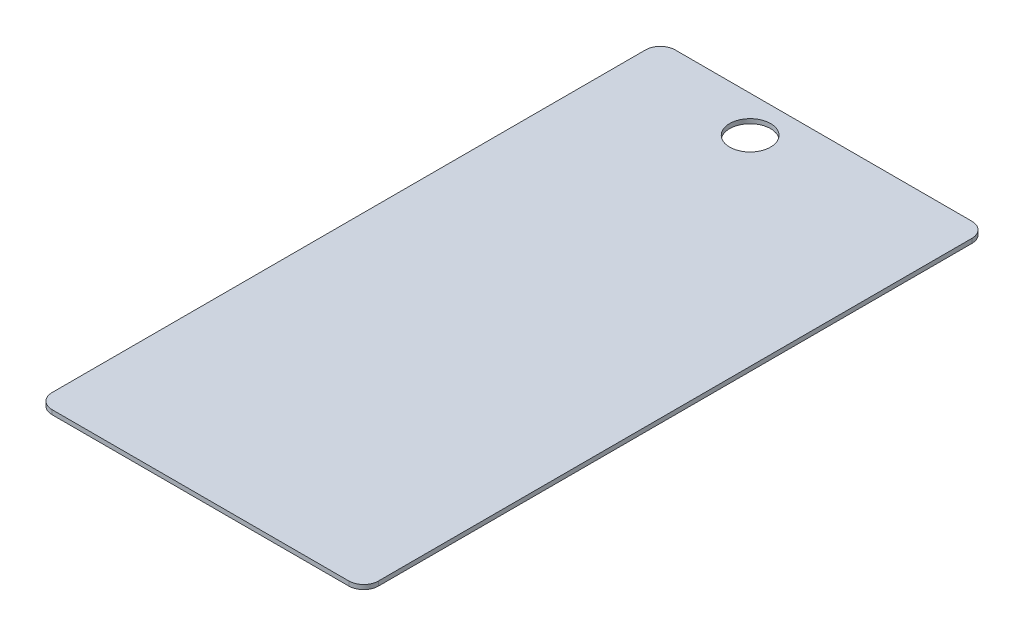
ISO-10303-21;
HEADER;
FILE_DESCRIPTION(('STEP AP214'),'2;1');
FILE_NAME('part.step','',(''),(''),'','','');
FILE_SCHEMA(('AUTOMOTIVE_DESIGN { 1 0 10303 214 1 1 1 1 }'));
ENDSEC;
DATA;
#1=APPLICATION_CONTEXT('core data for automotive mechanical design processes');
#2=APPLICATION_PROTOCOL_DEFINITION('international standard','automotive_design',2000,#1);
#3=PRODUCT_CONTEXT('',#1,'mechanical');
#4=PRODUCT('Part','Part','',(#3));
#5=PRODUCT_RELATED_PRODUCT_CATEGORY('part','',(#4));
#6=PRODUCT_DEFINITION_FORMATION('','',#4);
#7=PRODUCT_DEFINITION_CONTEXT('part definition',#1,'design');
#8=PRODUCT_DEFINITION('design','',#6,#7);
#9=PRODUCT_DEFINITION_SHAPE('','',#8);
#10=(LENGTH_UNIT() NAMED_UNIT(*) SI_UNIT(.MILLI.,.METRE.));
#11=(NAMED_UNIT(*) PLANE_ANGLE_UNIT() SI_UNIT($,.RADIAN.));
#12=(NAMED_UNIT(*) SI_UNIT($,.STERADIAN.) SOLID_ANGLE_UNIT());
#13=UNCERTAINTY_MEASURE_WITH_UNIT(LENGTH_MEASURE(1.E-05),#10,'distance_accuracy_value','');
#14=(GEOMETRIC_REPRESENTATION_CONTEXT(3) GLOBAL_UNCERTAINTY_ASSIGNED_CONTEXT((#13)) GLOBAL_UNIT_ASSIGNED_CONTEXT((#10,
#11,#12)) REPRESENTATION_CONTEXT('',''));
#15=CARTESIAN_POINT('',(0.,0.,0.));
#16=DIRECTION('',(0.,0.,1.));
#17=DIRECTION('',(1.,0.,0.));
#18=AXIS2_PLACEMENT_3D('',#15,#16,#17);
#19=CARTESIAN_POINT('',(9.31995011951406,0.3,-19.4799501195141));
#20=DIRECTION('',(0.,-1.,0.));
#21=DIRECTION('',(0.,0.,-1.));
#22=AXIS2_PLACEMENT_3D('',#19,#20,#21);
#23=CYLINDRICAL_SURFACE('',#22,0.999999999999999);
#24=CARTESIAN_POINT('',(9.31995011951406,0.,-19.4799501195141));
#25=DIRECTION('',(0.,1.,0.));
#26=DIRECTION('',(0.,0.,1.));
#27=AXIS2_PLACEMENT_3D('',#24,#25,#26);
#28=CIRCLE('',#27,0.999999999999999);
#29=CARTESIAN_POINT('',(10.3199501195141,0.,-19.4799501195141));
#30=VERTEX_POINT('',#29);
#31=CARTESIAN_POINT('',(9.31995011951406,0.,-20.4799501195141));
#32=VERTEX_POINT('',#31);
#33=EDGE_CURVE('E132',#30,#32,#28,.T.);
#34=ORIENTED_EDGE('',*,*,#33,.T.);
#35=DIRECTION('',(0.,-1.,0.));
#36=VECTOR('',#35,1.);
#37=CARTESIAN_POINT('',(9.31995011951406,0.3,-20.4799501195141));
#38=LINE('',#37,#36);
#39=CARTESIAN_POINT('',(9.31995011951406,0.3,-20.4799501195141));
#40=VERTEX_POINT('',#39);
#41=EDGE_CURVE('E11',#40,#32,#38,.T.);
#42=ORIENTED_EDGE('',*,*,#41,.F.);
#43=CARTESIAN_POINT('',(9.31995011951406,0.3,-19.4799501195141));
#44=DIRECTION('',(0.,1.,0.));
#45=DIRECTION('',(0.,0.,1.));
#46=AXIS2_PLACEMENT_3D('',#43,#44,#45);
#47=CIRCLE('',#46,0.999999999999999);
#48=CARTESIAN_POINT('',(10.3199501195141,0.3,-19.4799501195141));
#49=VERTEX_POINT('',#48);
#50=EDGE_CURVE('E147',#49,#40,#47,.T.);
#51=ORIENTED_EDGE('',*,*,#50,.F.);
#52=DIRECTION('',(0.,-1.,0.));
#53=VECTOR('',#52,1.);
#54=CARTESIAN_POINT('',(10.3199501195141,0.3,-19.4799501195141));
#55=LINE('',#54,#53);
#56=EDGE_CURVE('E128',#49,#30,#55,.T.);
#57=ORIENTED_EDGE('',*,*,#56,.T.);
#58=EDGE_LOOP('',(#34,#42,#51,#57));
#59=FACE_BOUND('',#58,.T.);
#60=ADVANCED_FACE('F36',(#59),#23,.T.);
#61=CARTESIAN_POINT('',(-10.6800498804859,0.3,-20.4799501195141));
#62=DIRECTION('',(0.,0.,1.));
#63=DIRECTION('',(1.,0.,0.));
#64=AXIS2_PLACEMENT_3D('',#61,#62,#63);
#65=PLANE('',#64);
#66=DIRECTION('',(-1.,0.,0.));
#67=VECTOR('',#66,1.);
#68=CARTESIAN_POINT('',(-10.6800498804859,0.,-20.4799501195141));
#69=LINE('',#68,#67);
#70=CARTESIAN_POINT('',(-10.6800498804859,0.,-20.4799501195141));
#71=VERTEX_POINT('',#70);
#72=EDGE_CURVE('E135',#32,#71,#69,.T.);
#73=ORIENTED_EDGE('',*,*,#72,.T.);
#74=DIRECTION('',(0.,-1.,0.));
#75=VECTOR('',#74,1.);
#76=CARTESIAN_POINT('',(-10.6800498804859,0.3,-20.4799501195141));
#77=LINE('',#76,#75);
#78=CARTESIAN_POINT('',(-10.6800498804859,0.3,-20.4799501195141));
#79=VERTEX_POINT('',#78);
#80=EDGE_CURVE('E44',#79,#71,#77,.T.);
#81=ORIENTED_EDGE('',*,*,#80,.F.);
#82=DIRECTION('',(-1.,0.,0.));
#83=VECTOR('',#82,1.);
#84=CARTESIAN_POINT('',(-10.6800498804859,0.3,-20.4799501195141));
#85=LINE('',#84,#83);
#86=EDGE_CURVE('E95',#40,#79,#85,.T.);
#87=ORIENTED_EDGE('',*,*,#86,.F.);
#88=ORIENTED_EDGE('',*,*,#41,.T.);
#89=EDGE_LOOP('',(#73,#81,#87,#88));
#90=FACE_BOUND('',#89,.T.);
#91=ADVANCED_FACE('F201',(#90),#65,.F.);
#92=CARTESIAN_POINT('',(-10.6800498804859,0.3,-19.4799501195141));
#93=DIRECTION('',(0.,-1.,0.));
#94=DIRECTION('',(0.,0.,-1.));
#95=AXIS2_PLACEMENT_3D('',#92,#93,#94);
#96=CYLINDRICAL_SURFACE('',#95,0.999999999999998);
#97=CARTESIAN_POINT('',(-10.6800498804859,0.,-19.4799501195141));
#98=DIRECTION('',(0.,1.,0.));
#99=DIRECTION('',(0.,0.,-1.));
#100=AXIS2_PLACEMENT_3D('',#97,#98,#99);
#101=CIRCLE('',#100,0.999999999999998);
#102=CARTESIAN_POINT('',(-11.6800498804859,0.,-19.4799501195141));
#103=VERTEX_POINT('',#102);
#104=EDGE_CURVE('E138',#71,#103,#101,.T.);
#105=ORIENTED_EDGE('',*,*,#104,.T.);
#106=DIRECTION('',(0.,-1.,0.));
#107=VECTOR('',#106,1.);
#108=CARTESIAN_POINT('',(-11.6800498804859,0.3,-19.4799501195141));
#109=LINE('',#108,#107);
#110=CARTESIAN_POINT('',(-11.6800498804859,0.3,-19.4799501195141));
#111=VERTEX_POINT('',#110);
#112=EDGE_CURVE('E154',#111,#103,#109,.T.);
#113=ORIENTED_EDGE('',*,*,#112,.F.);
#114=CARTESIAN_POINT('',(-10.6800498804859,0.3,-19.4799501195141));
#115=DIRECTION('',(0.,1.,0.));
#116=DIRECTION('',(0.,0.,-1.));
#117=AXIS2_PLACEMENT_3D('',#114,#115,#116);
#118=CIRCLE('',#117,0.999999999999998);
#119=EDGE_CURVE('E162',#79,#111,#118,.T.);
#120=ORIENTED_EDGE('',*,*,#119,.F.);
#121=ORIENTED_EDGE('',*,*,#80,.T.);
#122=EDGE_LOOP('',(#105,#113,#120,#121));
#123=FACE_BOUND('',#122,.T.);
#124=ADVANCED_FACE('F160',(#123),#96,.T.);
#125=CARTESIAN_POINT('',(-11.6800498804859,0.3,-19.4799501195141));
#126=DIRECTION('',(1.,0.,0.));
#127=DIRECTION('',(0.,0.,-1.));
#128=AXIS2_PLACEMENT_3D('',#125,#126,#127);
#129=PLANE('',#128);
#130=DIRECTION('',(0.,0.,1.));
#131=VECTOR('',#130,1.);
#132=CARTESIAN_POINT('',(-11.6800498804859,0.,-19.4799501195141));
#133=LINE('',#132,#131);
#134=CARTESIAN_POINT('',(-11.6800498804859,0.,20.5200498804859));
#135=VERTEX_POINT('',#134);
#136=EDGE_CURVE('E140',#103,#135,#133,.T.);
#137=ORIENTED_EDGE('',*,*,#136,.T.);
#138=DIRECTION('',(0.,-1.,0.));
#139=VECTOR('',#138,1.);
#140=CARTESIAN_POINT('',(-11.6800498804859,0.3,20.5200498804859));
#141=LINE('',#140,#139);
#142=CARTESIAN_POINT('',(-11.6800498804859,0.3,20.5200498804859));
#143=VERTEX_POINT('',#142);
#144=EDGE_CURVE('E151',#143,#135,#141,.T.);
#145=ORIENTED_EDGE('',*,*,#144,.F.);
#146=DIRECTION('',(0.,0.,1.));
#147=VECTOR('',#146,1.);
#148=CARTESIAN_POINT('',(-11.6800498804859,0.3,-19.4799501195141));
#149=LINE('',#148,#147);
#150=EDGE_CURVE('E174',#111,#143,#149,.T.);
#151=ORIENTED_EDGE('',*,*,#150,.F.);
#152=ORIENTED_EDGE('',*,*,#112,.T.);
#153=EDGE_LOOP('',(#137,#145,#151,#152));
#154=FACE_BOUND('',#153,.T.);
#155=ADVANCED_FACE('F170',(#154),#129,.F.);
#156=CARTESIAN_POINT('',(-10.6800498804859,0.3,20.5200498804859));
#157=DIRECTION('',(0.,-1.,0.));
#158=DIRECTION('',(0.,0.,-1.));
#159=AXIS2_PLACEMENT_3D('',#156,#157,#158);
#160=CYLINDRICAL_SURFACE('',#159,1.);
#161=CARTESIAN_POINT('',(-10.6800498804859,0.,20.5200498804859));
#162=DIRECTION('',(0.,1.,0.));
#163=DIRECTION('',(0.,0.,1.));
#164=AXIS2_PLACEMENT_3D('',#161,#162,#163);
#165=CIRCLE('',#164,1.);
#166=CARTESIAN_POINT('',(-10.6800498804859,0.,21.5200498804859));
#167=VERTEX_POINT('',#166);
#168=EDGE_CURVE('E142',#135,#167,#165,.T.);
#169=ORIENTED_EDGE('',*,*,#168,.T.);
#170=DIRECTION('',(0.,-1.,0.));
#171=VECTOR('',#170,1.);
#172=CARTESIAN_POINT('',(-10.6800498804859,0.3,21.5200498804859));
#173=LINE('',#172,#171);
#174=CARTESIAN_POINT('',(-10.6800498804859,0.3,21.5200498804859));
#175=VERTEX_POINT('',#174);
#176=EDGE_CURVE('E123',#175,#167,#173,.T.);
#177=ORIENTED_EDGE('',*,*,#176,.F.);
#178=CARTESIAN_POINT('',(-10.6800498804859,0.3,20.5200498804859));
#179=DIRECTION('',(0.,1.,0.));
#180=DIRECTION('',(0.,0.,1.));
#181=AXIS2_PLACEMENT_3D('',#178,#179,#180);
#182=CIRCLE('',#181,1.);
#183=EDGE_CURVE('E114',#143,#175,#182,.T.);
#184=ORIENTED_EDGE('',*,*,#183,.F.);
#185=ORIENTED_EDGE('',*,*,#144,.T.);
#186=EDGE_LOOP('',(#169,#177,#184,#185));
#187=FACE_BOUND('',#186,.T.);
#188=ADVANCED_FACE('F173',(#187),#160,.T.);
#189=CARTESIAN_POINT('',(-10.6800498804859,0.3,21.5200498804859));
#190=DIRECTION('',(0.,0.,-1.));
#191=DIRECTION('',(-1.,0.,0.));
#192=AXIS2_PLACEMENT_3D('',#189,#190,#191);
#193=PLANE('',#192);
#194=DIRECTION('',(1.,0.,0.));
#195=VECTOR('',#194,1.);
#196=CARTESIAN_POINT('',(-10.6800498804859,0.,21.5200498804859));
#197=LINE('',#196,#195);
#198=CARTESIAN_POINT('',(9.31995011951406,0.,21.5200498804859));
#199=VERTEX_POINT('',#198);
#200=EDGE_CURVE('E122',#167,#199,#197,.T.);
#201=ORIENTED_EDGE('',*,*,#200,.T.);
#202=DIRECTION('',(0.,-1.,0.));
#203=VECTOR('',#202,1.);
#204=CARTESIAN_POINT('',(9.31995011951406,0.3,21.5200498804859));
#205=LINE('',#204,#203);
#206=CARTESIAN_POINT('',(9.31995011951406,0.3,21.5200498804859));
#207=VERTEX_POINT('',#206);
#208=EDGE_CURVE('E119',#207,#199,#205,.T.);
#209=ORIENTED_EDGE('',*,*,#208,.F.);
#210=DIRECTION('',(1.,0.,0.));
#211=VECTOR('',#210,1.);
#212=CARTESIAN_POINT('',(-10.6800498804859,0.3,21.5200498804859));
#213=LINE('',#212,#211);
#214=EDGE_CURVE('E108',#175,#207,#213,.T.);
#215=ORIENTED_EDGE('',*,*,#214,.F.);
#216=ORIENTED_EDGE('',*,*,#176,.T.);
#217=EDGE_LOOP('',(#201,#209,#215,#216));
#218=FACE_BOUND('',#217,.T.);
#219=ADVANCED_FACE('F120',(#218),#193,.F.);
#220=CARTESIAN_POINT('',(9.31995011951406,0.3,20.5200498804859));
#221=DIRECTION('',(0.,-1.,0.));
#222=DIRECTION('',(0.,0.,-1.));
#223=AXIS2_PLACEMENT_3D('',#220,#221,#222);
#224=CYLINDRICAL_SURFACE('',#223,1.);
#225=CARTESIAN_POINT('',(9.31995011951406,0.,20.5200498804859));
#226=DIRECTION('',(0.,1.,0.));
#227=DIRECTION('',(0.,0.,-1.));
#228=AXIS2_PLACEMENT_3D('',#225,#226,#227);
#229=CIRCLE('',#228,1.);
#230=CARTESIAN_POINT('',(10.3199501195141,0.,20.5200498804859));
#231=VERTEX_POINT('',#230);
#232=EDGE_CURVE('E81',#199,#231,#229,.T.);
#233=ORIENTED_EDGE('',*,*,#232,.T.);
#234=DIRECTION('',(0.,-1.,0.));
#235=VECTOR('',#234,1.);
#236=CARTESIAN_POINT('',(10.3199501195141,0.3,20.5200498804859));
#237=LINE('',#236,#235);
#238=CARTESIAN_POINT('',(10.3199501195141,0.3,20.5200498804859));
#239=VERTEX_POINT('',#238);
#240=EDGE_CURVE('E124',#239,#231,#237,.T.);
#241=ORIENTED_EDGE('',*,*,#240,.F.);
#242=CARTESIAN_POINT('',(9.31995011951406,0.3,20.5200498804859));
#243=DIRECTION('',(0.,1.,0.));
#244=DIRECTION('',(0.,0.,-1.));
#245=AXIS2_PLACEMENT_3D('',#242,#243,#244);
#246=CIRCLE('',#245,1.);
#247=EDGE_CURVE('E112',#207,#239,#246,.T.);
#248=ORIENTED_EDGE('',*,*,#247,.F.);
#249=ORIENTED_EDGE('',*,*,#208,.T.);
#250=EDGE_LOOP('',(#233,#241,#248,#249));
#251=FACE_BOUND('',#250,.T.);
#252=ADVANCED_FACE('F126',(#251),#224,.T.);
#253=CARTESIAN_POINT('',(10.3199501195141,0.3,-19.4799501195141));
#254=DIRECTION('',(-1.,0.,0.));
#255=DIRECTION('',(0.,0.,1.));
#256=AXIS2_PLACEMENT_3D('',#253,#254,#255);
#257=PLANE('',#256);
#258=DIRECTION('',(0.,0.,-1.));
#259=VECTOR('',#258,1.);
#260=CARTESIAN_POINT('',(10.3199501195141,0.,-19.4799501195141));
#261=LINE('',#260,#259);
#262=EDGE_CURVE('E87',#231,#30,#261,.T.);
#263=ORIENTED_EDGE('',*,*,#262,.T.);
#264=ORIENTED_EDGE('',*,*,#56,.F.);
#265=DIRECTION('',(0.,0.,-1.));
#266=VECTOR('',#265,1.);
#267=CARTESIAN_POINT('',(10.3199501195141,0.3,-19.4799501195141));
#268=LINE('',#267,#266);
#269=EDGE_CURVE('E52',#239,#49,#268,.T.);
#270=ORIENTED_EDGE('',*,*,#269,.F.);
#271=ORIENTED_EDGE('',*,*,#240,.T.);
#272=EDGE_LOOP('',(#263,#264,#270,#271));
#273=FACE_BOUND('',#272,.T.);
#274=ADVANCED_FACE('F190',(#273),#257,.F.);
#275=CARTESIAN_POINT('',(9.31995011951406,0.3,-19.4799501195141));
#276=DIRECTION('',(0.,1.,0.));
#277=DIRECTION('',(0.,0.,1.));
#278=AXIS2_PLACEMENT_3D('',#275,#276,#277);
#279=PLANE('',#278);
#280=CARTESIAN_POINT('',(-3.16959158487934,0.3,-18.0200607642918));
#281=DIRECTION('',(0.,1.,0.));
#282=DIRECTION('',(0.,0.,1.));
#283=AXIS2_PLACEMENT_3D('',#280,#281,#282);
#284=CIRCLE('',#283,1.3777875503619);
#285=CARTESIAN_POINT('',(-3.16959158487934,0.3,-16.6422732139299));
#286=VERTEX_POINT('',#285);
#287=EDGE_CURVE('E182',#286,#286,#284,.T.);
#288=ORIENTED_EDGE('',*,*,#287,.F.);
#289=EDGE_LOOP('',(#288));
#290=FACE_BOUND('',#289,.T.);
#291=ORIENTED_EDGE('',*,*,#50,.T.);
#292=ORIENTED_EDGE('',*,*,#86,.T.);
#293=ORIENTED_EDGE('',*,*,#119,.T.);
#294=ORIENTED_EDGE('',*,*,#150,.T.);
#295=ORIENTED_EDGE('',*,*,#183,.T.);
#296=ORIENTED_EDGE('',*,*,#214,.T.);
#297=ORIENTED_EDGE('',*,*,#247,.T.);
#298=ORIENTED_EDGE('',*,*,#269,.T.);
#299=EDGE_LOOP('',(#291,#292,#293,#294,#295,#296,#297,#298));
#300=FACE_BOUND('',#299,.T.);
#301=ADVANCED_FACE('F110',(#290,#300),#279,.T.);
#302=CARTESIAN_POINT('',(9.31995011951406,0.,-19.4799501195141));
#303=DIRECTION('',(0.,1.,0.));
#304=DIRECTION('',(0.,0.,1.));
#305=AXIS2_PLACEMENT_3D('',#302,#303,#304);
#306=PLANE('',#305);
#307=CARTESIAN_POINT('',(-3.16959158487934,0.,-18.0200607642918));
#308=DIRECTION('',(0.,1.,0.));
#309=DIRECTION('',(0.,0.,1.));
#310=AXIS2_PLACEMENT_3D('',#307,#308,#309);
#311=CIRCLE('',#310,1.3777875503619);
#312=CARTESIAN_POINT('',(-3.16959158487934,0.,-16.6422732139299));
#313=VERTEX_POINT('',#312);
#314=EDGE_CURVE('E136',#313,#313,#311,.F.);
#315=ORIENTED_EDGE('',*,*,#314,.F.);
#316=EDGE_LOOP('',(#315));
#317=FACE_BOUND('',#316,.T.);
#318=ORIENTED_EDGE('',*,*,#33,.F.);
#319=ORIENTED_EDGE('',*,*,#262,.F.);
#320=ORIENTED_EDGE('',*,*,#232,.F.);
#321=ORIENTED_EDGE('',*,*,#200,.F.);
#322=ORIENTED_EDGE('',*,*,#168,.F.);
#323=ORIENTED_EDGE('',*,*,#136,.F.);
#324=ORIENTED_EDGE('',*,*,#104,.F.);
#325=ORIENTED_EDGE('',*,*,#72,.F.);
#326=EDGE_LOOP('',(#318,#319,#320,#321,#322,#323,#324,#325));
#327=FACE_BOUND('',#326,.T.);
#328=ADVANCED_FACE('F166',(#317,#327),#306,.F.);
#329=CARTESIAN_POINT('',(-3.16959158487934,-0.00100000000000002,-18.0200607642918));
#330=DIRECTION('',(0.,1.,0.));
#331=DIRECTION('',(0.,0.,1.));
#332=AXIS2_PLACEMENT_3D('',#329,#330,#331);
#333=CYLINDRICAL_SURFACE('',#332,1.3777875503619);
#334=ORIENTED_EDGE('',*,*,#287,.T.);
#335=EDGE_LOOP('',(#334));
#336=FACE_BOUND('',#335,.T.);
#337=ORIENTED_EDGE('',*,*,#314,.T.);
#338=EDGE_LOOP('',(#337));
#339=FACE_BOUND('',#338,.T.);
#340=ADVANCED_FACE('F186',(#336,#339),#333,.F.);
#341=CLOSED_SHELL('',(#60,#91,#124,#155,#188,#219,#252,#274,#301,#328,#340));
#342=MANIFOLD_SOLID_BREP('B2',#341);
#343=ADVANCED_BREP_SHAPE_REPRESENTATION('',(#18,#342),#14);
#344=SHAPE_DEFINITION_REPRESENTATION(#9,#343);
ENDSEC;
END-ISO-10303-21;
